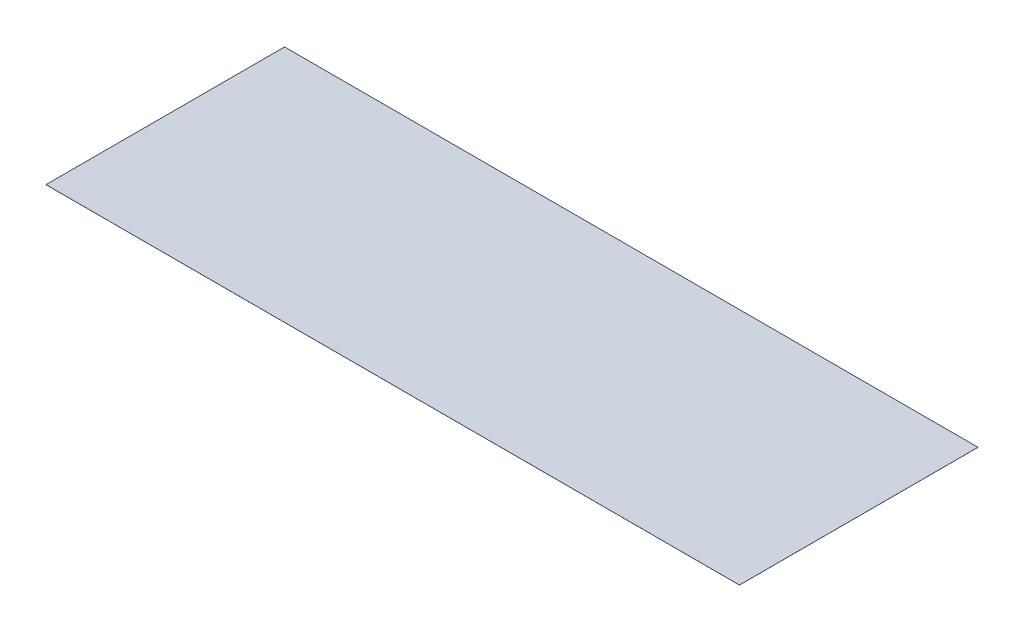
ISO-10303-21;
HEADER;
FILE_DESCRIPTION(('STEP AP214'),'2;1');
FILE_NAME('part.step','',(''),(''),'','','');
FILE_SCHEMA(('AUTOMOTIVE_DESIGN { 1 0 10303 214 1 1 1 1 }'));
ENDSEC;
DATA;
#1=APPLICATION_CONTEXT('core data for automotive mechanical design processes');
#2=APPLICATION_PROTOCOL_DEFINITION('international standard','automotive_design',2000,#1);
#3=PRODUCT_CONTEXT('',#1,'mechanical');
#4=PRODUCT('Part','Part','',(#3));
#5=PRODUCT_RELATED_PRODUCT_CATEGORY('part','',(#4));
#6=PRODUCT_DEFINITION_FORMATION('','',#4);
#7=PRODUCT_DEFINITION_CONTEXT('part definition',#1,'design');
#8=PRODUCT_DEFINITION('design','',#6,#7);
#9=PRODUCT_DEFINITION_SHAPE('','',#8);
#10=(LENGTH_UNIT() NAMED_UNIT(*) SI_UNIT(.MILLI.,.METRE.));
#11=(NAMED_UNIT(*) PLANE_ANGLE_UNIT() SI_UNIT($,.RADIAN.));
#12=(NAMED_UNIT(*) SI_UNIT($,.STERADIAN.) SOLID_ANGLE_UNIT());
#13=UNCERTAINTY_MEASURE_WITH_UNIT(LENGTH_MEASURE(1.E-05),#10,'distance_accuracy_value','');
#14=(GEOMETRIC_REPRESENTATION_CONTEXT(3) GLOBAL_UNCERTAINTY_ASSIGNED_CONTEXT((#13)) GLOBAL_UNIT_ASSIGNED_CONTEXT((#10,
#11,#12)) REPRESENTATION_CONTEXT('',''));
#15=CARTESIAN_POINT('',(0.,0.,0.));
#16=DIRECTION('',(0.,0.,1.));
#17=DIRECTION('',(1.,0.,0.));
#18=AXIS2_PLACEMENT_3D('',#15,#16,#17);
#19=CARTESIAN_POINT('',(-675.502899008319,1.,5492.48053491251));
#20=DIRECTION('',(0.,0.,-1.));
#21=DIRECTION('',(-1.,0.,0.));
#22=AXIS2_PLACEMENT_3D('',#19,#20,#21);
#23=PLANE('',#22);
#24=DIRECTION('',(1.,0.,0.));
#25=VECTOR('',#24,1.);
#26=CARTESIAN_POINT('',(-675.502899008319,0.,5492.48053491251));
#27=LINE('',#26,#25);
#28=CARTESIAN_POINT('',(-675.502899008319,0.,5492.48053491251));
#29=VERTEX_POINT('',#28);
#30=CARTESIAN_POINT('',(16045.3682412219,0.,5492.48053491251));
#31=VERTEX_POINT('',#30);
#32=EDGE_CURVE('E106',#29,#31,#27,.T.);
#33=ORIENTED_EDGE('',*,*,#32,.T.);
#34=DIRECTION('',(0.,-1.,0.));
#35=VECTOR('',#34,1.);
#36=CARTESIAN_POINT('',(16045.3682412219,1.,5492.48053491251));
#37=LINE('',#36,#35);
#38=CARTESIAN_POINT('',(16045.3682412219,1.,5492.48053491251));
#39=VERTEX_POINT('',#38);
#40=EDGE_CURVE('E11',#39,#31,#37,.T.);
#41=ORIENTED_EDGE('',*,*,#40,.F.);
#42=DIRECTION('',(1.,0.,0.));
#43=VECTOR('',#42,1.);
#44=CARTESIAN_POINT('',(-675.502899008319,1.,5492.48053491251));
#45=LINE('',#44,#43);
#46=CARTESIAN_POINT('',(-675.502899008319,1.,5492.48053491251));
#47=VERTEX_POINT('',#46);
#48=EDGE_CURVE('E79',#47,#39,#45,.T.);
#49=ORIENTED_EDGE('',*,*,#48,.F.);
#50=DIRECTION('',(0.,-1.,0.));
#51=VECTOR('',#50,1.);
#52=CARTESIAN_POINT('',(-675.502899008319,1.,5492.48053491251));
#53=LINE('',#52,#51);
#54=EDGE_CURVE('E102',#47,#29,#53,.T.);
#55=ORIENTED_EDGE('',*,*,#54,.T.);
#56=EDGE_LOOP('',(#33,#41,#49,#55));
#57=FACE_BOUND('',#56,.T.);
#58=ADVANCED_FACE('F39',(#57),#23,.F.);
#59=CARTESIAN_POINT('',(16045.3682412219,1.,-259.495244623948));
#60=DIRECTION('',(1.,0.,0.));
#61=DIRECTION('',(0.,0.,-1.));
#62=AXIS2_PLACEMENT_3D('',#59,#60,#61);
#63=PLANE('',#62);
#64=DIRECTION('',(0.,0.,1.));
#65=VECTOR('',#64,1.);
#66=CARTESIAN_POINT('',(16045.3682412219,0.,-259.495244623948));
#67=LINE('',#66,#65);
#68=CARTESIAN_POINT('',(16045.3682412219,0.,-259.495244623948));
#69=VERTEX_POINT('',#68);
#70=EDGE_CURVE('E88',#69,#31,#67,.T.);
#71=ORIENTED_EDGE('',*,*,#70,.F.);
#72=DIRECTION('',(0.,-1.,0.));
#73=VECTOR('',#72,1.);
#74=CARTESIAN_POINT('',(16045.3682412219,1.,-259.495244623948));
#75=LINE('',#74,#73);
#76=CARTESIAN_POINT('',(16045.3682412219,1.,-259.495244623948));
#77=VERTEX_POINT('',#76);
#78=EDGE_CURVE('E48',#77,#69,#75,.T.);
#79=ORIENTED_EDGE('',*,*,#78,.F.);
#80=DIRECTION('',(0.,0.,1.));
#81=VECTOR('',#80,1.);
#82=CARTESIAN_POINT('',(16045.3682412219,1.,-259.495244623948));
#83=LINE('',#82,#81);
#84=EDGE_CURVE('E86',#77,#39,#83,.T.);
#85=ORIENTED_EDGE('',*,*,#84,.T.);
#86=ORIENTED_EDGE('',*,*,#40,.T.);
#87=EDGE_LOOP('',(#71,#79,#85,#86));
#88=FACE_BOUND('',#87,.T.);
#89=ADVANCED_FACE('F85',(#88),#63,.T.);
#90=CARTESIAN_POINT('',(-675.502899008319,1.,-259.495244623948));
#91=DIRECTION('',(0.,0.,-1.));
#92=DIRECTION('',(-1.,0.,0.));
#93=AXIS2_PLACEMENT_3D('',#90,#91,#92);
#94=PLANE('',#93);
#95=DIRECTION('',(1.,0.,0.));
#96=VECTOR('',#95,1.);
#97=CARTESIAN_POINT('',(-675.502899008319,0.,-259.495244623948));
#98=LINE('',#97,#96);
#99=CARTESIAN_POINT('',(-675.502899008319,0.,-259.495244623948));
#100=VERTEX_POINT('',#99);
#101=EDGE_CURVE('E112',#100,#69,#98,.T.);
#102=ORIENTED_EDGE('',*,*,#101,.F.);
#103=DIRECTION('',(0.,-1.,0.));
#104=VECTOR('',#103,1.);
#105=CARTESIAN_POINT('',(-675.502899008319,1.,-259.495244623948));
#106=LINE('',#105,#104);
#107=CARTESIAN_POINT('',(-675.502899008319,1.,-259.495244623948));
#108=VERTEX_POINT('',#107);
#109=EDGE_CURVE('E71',#108,#100,#106,.T.);
#110=ORIENTED_EDGE('',*,*,#109,.F.);
#111=DIRECTION('',(1.,0.,0.));
#112=VECTOR('',#111,1.);
#113=CARTESIAN_POINT('',(-675.502899008319,1.,-259.495244623948));
#114=LINE('',#113,#112);
#115=EDGE_CURVE('E95',#108,#77,#114,.T.);
#116=ORIENTED_EDGE('',*,*,#115,.T.);
#117=ORIENTED_EDGE('',*,*,#78,.T.);
#118=EDGE_LOOP('',(#102,#110,#116,#117));
#119=FACE_BOUND('',#118,.T.);
#120=ADVANCED_FACE('F98',(#119),#94,.T.);
#121=CARTESIAN_POINT('',(-675.502899008319,1.,-259.495244623948));
#122=DIRECTION('',(1.,0.,0.));
#123=DIRECTION('',(0.,0.,-1.));
#124=AXIS2_PLACEMENT_3D('',#121,#122,#123);
#125=PLANE('',#124);
#126=DIRECTION('',(0.,0.,1.));
#127=VECTOR('',#126,1.);
#128=CARTESIAN_POINT('',(-675.502899008319,0.,-259.495244623948));
#129=LINE('',#128,#127);
#130=EDGE_CURVE('E74',#100,#29,#129,.T.);
#131=ORIENTED_EDGE('',*,*,#130,.T.);
#132=ORIENTED_EDGE('',*,*,#54,.F.);
#133=DIRECTION('',(0.,0.,1.));
#134=VECTOR('',#133,1.);
#135=CARTESIAN_POINT('',(-675.502899008319,1.,-259.495244623948));
#136=LINE('',#135,#134);
#137=EDGE_CURVE('E56',#108,#47,#136,.T.);
#138=ORIENTED_EDGE('',*,*,#137,.F.);
#139=ORIENTED_EDGE('',*,*,#109,.T.);
#140=EDGE_LOOP('',(#131,#132,#138,#139));
#141=FACE_BOUND('',#140,.T.);
#142=ADVANCED_FACE('F129',(#141),#125,.F.);
#143=CARTESIAN_POINT('',(0.,1.,0.));
#144=DIRECTION('',(0.,-1.,0.));
#145=DIRECTION('',(0.,0.,-1.));
#146=AXIS2_PLACEMENT_3D('',#143,#144,#145);
#147=PLANE('',#146);
#148=ORIENTED_EDGE('',*,*,#48,.T.);
#149=ORIENTED_EDGE('',*,*,#84,.F.);
#150=ORIENTED_EDGE('',*,*,#115,.F.);
#151=ORIENTED_EDGE('',*,*,#137,.T.);
#152=EDGE_LOOP('',(#148,#149,#150,#151));
#153=FACE_BOUND('',#152,.T.);
#154=ADVANCED_FACE('F94',(#153),#147,.F.);
#155=CARTESIAN_POINT('',(0.,0.,0.));
#156=DIRECTION('',(0.,-1.,0.));
#157=DIRECTION('',(0.,0.,-1.));
#158=AXIS2_PLACEMENT_3D('',#155,#156,#157);
#159=PLANE('',#158);
#160=ORIENTED_EDGE('',*,*,#32,.F.);
#161=ORIENTED_EDGE('',*,*,#130,.F.);
#162=ORIENTED_EDGE('',*,*,#101,.T.);
#163=ORIENTED_EDGE('',*,*,#70,.T.);
#164=EDGE_LOOP('',(#160,#161,#162,#163));
#165=FACE_BOUND('',#164,.T.);
#166=ADVANCED_FACE('F123',(#165),#159,.T.);
#167=CLOSED_SHELL('',(#58,#89,#120,#142,#154,#166));
#168=MANIFOLD_SOLID_BREP('B2',#167);
#169=ADVANCED_BREP_SHAPE_REPRESENTATION('',(#18,#168),#14);
#170=SHAPE_DEFINITION_REPRESENTATION(#9,#169);
ENDSEC;
END-ISO-10303-21;
